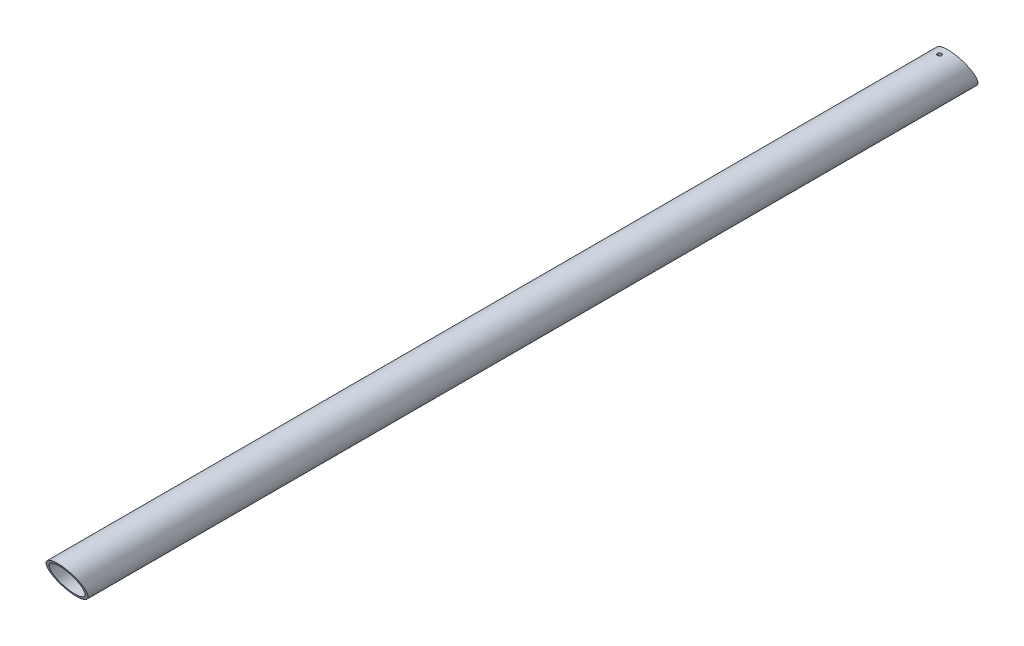
ISO-10303-21;
HEADER;
FILE_DESCRIPTION(('STEP AP214'),'2;1');
FILE_NAME('part.step','',(''),(''),'','','');
FILE_SCHEMA(('AUTOMOTIVE_DESIGN { 1 0 10303 214 1 1 1 1 }'));
ENDSEC;
DATA;
#1=APPLICATION_CONTEXT('core data for automotive mechanical design processes');
#2=APPLICATION_PROTOCOL_DEFINITION('international standard','automotive_design',2000,#1);
#3=PRODUCT_CONTEXT('',#1,'mechanical');
#4=PRODUCT('Part','Part','',(#3));
#5=PRODUCT_RELATED_PRODUCT_CATEGORY('part','',(#4));
#6=PRODUCT_DEFINITION_FORMATION('','',#4);
#7=PRODUCT_DEFINITION_CONTEXT('part definition',#1,'design');
#8=PRODUCT_DEFINITION('design','',#6,#7);
#9=PRODUCT_DEFINITION_SHAPE('','',#8);
#10=(LENGTH_UNIT() NAMED_UNIT(*) SI_UNIT(.MILLI.,.METRE.));
#11=(NAMED_UNIT(*) PLANE_ANGLE_UNIT() SI_UNIT($,.RADIAN.));
#12=(NAMED_UNIT(*) SI_UNIT($,.STERADIAN.) SOLID_ANGLE_UNIT());
#13=UNCERTAINTY_MEASURE_WITH_UNIT(LENGTH_MEASURE(1.E-05),#10,'distance_accuracy_value','');
#14=(GEOMETRIC_REPRESENTATION_CONTEXT(3) GLOBAL_UNCERTAINTY_ASSIGNED_CONTEXT((#13)) GLOBAL_UNIT_ASSIGNED_CONTEXT((#10,
#11,#12)) REPRESENTATION_CONTEXT('',''));
#15=CARTESIAN_POINT('',(0.,0.,0.));
#16=DIRECTION('',(0.,0.,1.));
#17=DIRECTION('',(1.,0.,0.));
#18=AXIS2_PLACEMENT_3D('',#15,#16,#17);
#19=CARTESIAN_POINT('',(0.,0.,914.4));
#20=DIRECTION('',(0.,0.,-1.));
#21=DIRECTION('',(-1.,0.,0.));
#22=AXIS2_PLACEMENT_3D('',#19,#20,#21);
#23=CYLINDRICAL_SURFACE('',#22,36.5125);
#24=CARTESIAN_POINT('',(0.,-36.5125,-859.6249));
#25=CARTESIAN_POINT('',(0.222576487814271,-36.5124972377471,-859.624909582565));
#26=CARTESIAN_POINT('',(0.445297477595568,-36.5104432118572,-859.643656950353));
#27=CARTESIAN_POINT('',(0.884557222297888,-36.50244682663,-859.718156608527));
#28=CARTESIAN_POINT('',(1.10108901820876,-36.4965002572248,-859.773948966693));
#29=CARTESIAN_POINT('',(1.521546422031,-36.4813896023316,-859.920888581349));
#30=CARTESIAN_POINT('',(1.72547983963618,-36.4722275341425,-860.012013674981));
#31=CARTESIAN_POINT('',(2.11511524353912,-36.4517085526281,-860.226987155));
#32=CARTESIAN_POINT('',(2.30082068103478,-36.4403520559988,-860.350829330437));
#33=CARTESIAN_POINT('',(2.64955650870538,-36.4166612749391,-860.628282758815));
#34=CARTESIAN_POINT('',(2.8124988704181,-36.4043234692108,-860.782004366179));
#35=CARTESIAN_POINT('',(3.11032605501735,-36.3800894909761,-861.11461699913));
#36=CARTESIAN_POINT('',(3.24520953827056,-36.3681933395782,-861.293509225771));
#37=CARTESIAN_POINT('',(3.48340781949558,-36.3461541705201,-861.67194371506));
#38=CARTESIAN_POINT('',(3.58664193717779,-36.3360156615186,-861.871537045479));
#39=CARTESIAN_POINT('',(3.75809588257937,-36.3186844715072,-862.285354938159));
#40=CARTESIAN_POINT('',(3.82631672654572,-36.3114917049996,-862.499579075563));
#41=CARTESIAN_POINT('',(3.92554420544375,-36.3008989519808,-862.935673654315));
#42=CARTESIAN_POINT('',(3.95669785359916,-36.2974839860447,-863.157510274744));
#43=CARTESIAN_POINT('',(3.98136120463624,-36.2947872519366,-863.603287689579));
#44=CARTESIAN_POINT('',(3.97487206914869,-36.2955053562208,-863.827228418842));
#45=CARTESIAN_POINT('',(3.92455505880391,-36.3009799320732,-864.269840134601));
#46=CARTESIAN_POINT('',(3.88088816678416,-36.3057189922581,-864.4885296677));
#47=CARTESIAN_POINT('',(3.75770589890405,-36.3186743323957,-864.9154577959));
#48=CARTESIAN_POINT('',(3.67818995836907,-36.3268906671205,-865.123696226324));
#49=CARTESIAN_POINT('',(3.485390607127,-36.3458947365218,-865.524316788054));
#50=CARTESIAN_POINT('',(3.37203625850148,-36.3566878635024,-865.71666451416));
#51=CARTESIAN_POINT('',(3.11482869938563,-36.3796249936669,-866.079666964137));
#52=CARTESIAN_POINT('',(2.97097443022705,-36.3917690437351,-866.250320934677));
#53=CARTESIAN_POINT('',(2.65595368769807,-36.4161172393799,-866.566026751027));
#54=CARTESIAN_POINT('',(2.48464827349666,-36.4283213669958,-866.710939995));
#55=CARTESIAN_POINT('',(2.12006908159625,-36.4513548335843,-866.969974918784));
#56=CARTESIAN_POINT('',(1.92679527180328,-36.4621841705483,-867.084096553612));
#57=CARTESIAN_POINT('',(1.52366601267144,-36.4812524218207,-867.278305066358));
#58=CARTESIAN_POINT('',(1.31380688536612,-36.4894907595198,-867.358384369778));
#59=CARTESIAN_POINT('',(0.883511798715035,-36.5024431483423,-867.482130707157));
#60=CARTESIAN_POINT('',(0.663076214768598,-36.5071573244535,-867.525799032471));
#61=CARTESIAN_POINT('',(0.219085242152332,-36.5125141178095,-867.575306743752));
#62=CARTESIAN_POINT('',(-0.00444859399231968,-36.513177308379,-867.581337280301));
#63=CARTESIAN_POINT('',(-0.449343632848794,-36.510412699337,-867.5559010716));
#64=CARTESIAN_POINT('',(-0.670704870399961,-36.5069849654353,-867.524434928633));
#65=CARTESIAN_POINT('',(-1.10441530596434,-36.496436690658,-867.425057228068));
#66=CARTESIAN_POINT('',(-1.31678537672704,-36.4893252748372,-867.357235713995));
#67=CARTESIAN_POINT('',(-1.72713525883041,-36.4722068648933,-867.187165364691));
#68=CARTESIAN_POINT('',(-1.9251146914091,-36.4621997945909,-867.084915623706));
#69=CARTESIAN_POINT('',(-2.30192417735271,-36.440356870867,-866.848421083629));
#70=CARTESIAN_POINT('',(-2.48067539179892,-36.428513940605,-866.714051333954));
#71=CARTESIAN_POINT('',(-2.81315496305789,-36.4043494193106,-866.417309404879));
#72=CARTESIAN_POINT('',(-2.96688257256198,-36.3920278139966,-866.254936389483));
#73=CARTESIAN_POINT('',(-3.24561967609136,-36.3682322299211,-865.905960378087));
#74=CARTESIAN_POINT('',(-3.37050329598346,-36.3567621093008,-865.719256542258));
#75=CARTESIAN_POINT('',(-3.58714071853,-36.3360285567761,-865.327413421149));
#76=CARTESIAN_POINT('',(-3.67889504581163,-36.3267650899285,-865.122274427868));
#77=CARTESIAN_POINT('',(-3.82646086141407,-36.3115186010345,-864.699807371848));
#78=CARTESIAN_POINT('',(-3.88234594574628,-36.3055288657666,-864.482505268278));
#79=CARTESIAN_POINT('',(-3.9568251409978,-36.2974877504063,-864.041532764793));
#80=CARTESIAN_POINT('',(-3.97542053839238,-36.2954362344473,-863.817862584843));
#81=CARTESIAN_POINT('',(-3.97477276641279,-36.2955070811856,-863.371754520657));
#82=CARTESIAN_POINT('',(-3.95572732519548,-36.2976076329876,-863.149316319595));
#83=CARTESIAN_POINT('',(-3.88075445043226,-36.3056993058763,-862.710820470872));
#84=CARTESIAN_POINT('',(-3.82482698630575,-36.3116904301888,-862.494762828501));
#85=CARTESIAN_POINT('',(-3.67773467286497,-36.3268819233913,-862.075170900228));
#86=CARTESIAN_POINT('',(-3.58657688352511,-36.3360816492582,-861.871634114677));
#87=CARTESIAN_POINT('',(-3.37163146655096,-36.3566550005084,-861.48271683777));
#88=CARTESIAN_POINT('',(-3.24784382465143,-36.3680286268423,-861.297336354351));
#89=CARTESIAN_POINT('',(-2.97041237664754,-36.3917398909193,-860.948981063546));
#90=CARTESIAN_POINT('',(-2.81662109194203,-36.4040821027636,-860.786124015261));
#91=CARTESIAN_POINT('',(-2.48384716766111,-36.4282984789628,-860.488446357396));
#92=CARTESIAN_POINT('',(-2.30485853632909,-36.4401725311303,-860.353632435226));
#93=CARTESIAN_POINT('',(-1.926185400205,-36.4621517964115,-860.115546828703));
#94=CARTESIAN_POINT('',(-1.72644178275622,-36.4722517239211,-860.012368737499));
#95=CARTESIAN_POINT('',(-1.3124762749608,-36.4894889518875,-859.84115882602));
#96=CARTESIAN_POINT('',(-1.09827081732187,-36.4966295512151,-859.773087849754));
#97=CARTESIAN_POINT('',(-0.735738160125483,-36.505373221796,-859.690775633001));
#98=CARTESIAN_POINT('',(-0.589718831172929,-36.5080331190741,-859.666106592913));
#99=CARTESIAN_POINT('',(-0.295820942177845,-36.5115974216966,-859.633165633659));
#100=CARTESIAN_POINT('',(-0.147942391646113,-36.5125018360174,-859.62489363065));
#101=CARTESIAN_POINT('',(0.,-36.5125,-859.6249));
#102=B_SPLINE_CURVE_WITH_KNOTS('',3,(#24,#25,#26,#27,#28,#29,#30,#31,#32,#33,#34,#35,#36,#37,
#38,#39,#40,#41,#42,#43,#44,#45,#46,#47,#48,#49,#50,#51,#52,#53,#54,#55,#56,#57,#58,#59,#60,#61,
#62,#63,#64,#65,#66,#67,#68,#69,#70,#71,#72,#73,#74,#75,#76,#77,#78,#79,#80,#81,#82,#83,#84,#85,
#86,#87,#88,#89,#90,#91,#92,#93,#94,#95,#96,#97,#98,#99,#100,#101),.UNSPECIFIED.,.T.,.F.,(4,2,2,
2,2,2,2,2,2,2,2,2,2,2,2,2,2,2,2,2,2,2,2,2,2,2,2,2,2,2,2,2,2,2,2,2,2,2,4),(0.,0.667189182881102,
1.33510117418783,2.00259488615256,2.66996197330431,3.33984237652412,4.00975475494342,
4.68136093445516,5.35294761975023,6.0218617321892,6.69075520250194,7.35676695243474,
8.02278919338708,8.69021758932518,9.35766915584735,10.0286123432556,10.6995565108677,
11.3706498870861,12.0417194612026,12.7093780903153,13.3770259954411,14.0430278861025,
14.7090472996082,15.3777010232387,16.0463747119816,16.717913542389,17.3894417380089,
18.0595876593161,18.7297104605317,19.3963224475249,20.0629349872376,20.729414010464,
21.3958933250645,22.0657351419396,22.7357365125185,23.4077013399665,24.07891507578,
24.5223854040618,24.9658534647054),.UNSPECIFIED.);
#103=CARTESIAN_POINT('',(0.,-36.5125,-859.6249));
#104=VERTEX_POINT('',#103);
#105=EDGE_CURVE('E57',#104,#104,#102,.T.);
#106=ORIENTED_EDGE('',*,*,#105,.T.);
#107=EDGE_LOOP('',(#106));
#108=FACE_BOUND('',#107,.T.);
#109=CARTESIAN_POINT('',(0.,0.,-861.441));
#110=DIRECTION('',(0.,-0.441082980740271,0.897466324772845));
#111=DIRECTION('',(0.,-0.897466324772845,-0.441082980740271));
#112=AXIS2_PLACEMENT_3D('',#109,#110,#111);
#113=ELLIPSE('',#112,40.6839777628888,36.5125);
#114=CARTESIAN_POINT('',(0.,-36.5125,-879.386010180026));
#115=VERTEX_POINT('',#114);
#116=EDGE_CURVE('E50',#115,#115,#113,.T.);
#117=ORIENTED_EDGE('',*,*,#116,.T.);
#118=EDGE_LOOP('',(#117));
#119=FACE_BOUND('',#118,.T.);
#120=CARTESIAN_POINT('',(0.,0.,861.441));
#121=DIRECTION('',(0.,0.441082980740271,-0.897466324772845));
#122=DIRECTION('',(0.,-0.897466324772845,-0.441082980740271));
#123=AXIS2_PLACEMENT_3D('',#120,#121,#122);
#124=ELLIPSE('',#123,40.6839777628888,36.5125);
#125=CARTESIAN_POINT('',(0.,-36.5125,843.495989819974));
#126=VERTEX_POINT('',#125);
#127=EDGE_CURVE('E10',#126,#126,#124,.T.);
#128=ORIENTED_EDGE('',*,*,#127,.T.);
#129=EDGE_LOOP('',(#128));
#130=FACE_BOUND('',#129,.T.);
#131=CARTESIAN_POINT('',(0.,36.5125,-831.596089819974));
#132=CARTESIAN_POINT('',(-0.222576487814271,36.5124972377471,-831.596080237409));
#133=CARTESIAN_POINT('',(-0.445297477595569,36.5104432118572,-831.577332869621));
#134=CARTESIAN_POINT('',(-0.884557222297887,36.50244682663,-831.502833211447));
#135=CARTESIAN_POINT('',(-1.10108901820875,36.4965002572248,-831.447040853281));
#136=CARTESIAN_POINT('',(-1.52154642203101,36.4813896023316,-831.300101238625));
#137=CARTESIAN_POINT('',(-1.72547983963622,36.4722275341425,-831.208976144993));
#138=CARTESIAN_POINT('',(-2.11511524353916,36.4517085526281,-830.994002664974));
#139=CARTESIAN_POINT('',(-2.3008206810348,36.4403520559988,-830.870160489537));
#140=CARTESIAN_POINT('',(-2.64955650870538,36.4166612749391,-830.592707061159));
#141=CARTESIAN_POINT('',(-2.8124988704181,36.4043234692108,-830.438985453795));
#142=CARTESIAN_POINT('',(-3.11032605501735,36.3800894909761,-830.106372820844));
#143=CARTESIAN_POINT('',(-3.24520953827057,36.3681933395782,-829.927480594203));
#144=CARTESIAN_POINT('',(-3.48340781949557,36.3461541705201,-829.549046104914));
#145=CARTESIAN_POINT('',(-3.58664193717775,36.3360156615186,-829.349452774495));
#146=CARTESIAN_POINT('',(-3.75809588257934,36.3186844715072,-828.935634881815));
#147=CARTESIAN_POINT('',(-3.82631672654571,36.3114917049996,-828.721410744411));
#148=CARTESIAN_POINT('',(-3.92554420544377,36.3008989519808,-828.285316165659));
#149=CARTESIAN_POINT('',(-3.95669785359918,36.2974839860447,-828.06347954523));
#150=CARTESIAN_POINT('',(-3.98136120463624,36.2947872519366,-827.617702130395));
#151=CARTESIAN_POINT('',(-3.97487206914868,36.2955053562208,-827.393761401132));
#152=CARTESIAN_POINT('',(-3.92455505880391,36.3009799320732,-826.951149685373));
#153=CARTESIAN_POINT('',(-3.88088816678415,36.3057189922581,-826.732460152274));
#154=CARTESIAN_POINT('',(-3.75770589890402,36.3186743323957,-826.305532024074));
#155=CARTESIAN_POINT('',(-3.67818995836905,36.3268906671205,-826.09729359365));
#156=CARTESIAN_POINT('',(-3.48539060712699,36.3458947365218,-825.696673031921));
#157=CARTESIAN_POINT('',(-3.37203625850146,36.3566878635024,-825.504325305814));
#158=CARTESIAN_POINT('',(-3.1148286993856,36.3796249936669,-825.141322855837));
#159=CARTESIAN_POINT('',(-2.97097443022703,36.3917690437351,-824.970668885297));
#160=CARTESIAN_POINT('',(-2.65595368769807,36.4161172393799,-824.654963068947));
#161=CARTESIAN_POINT('',(-2.48464827349666,36.4283213669958,-824.510049824974));
#162=CARTESIAN_POINT('',(-2.12006908159625,36.4513548335843,-824.25101490119));
#163=CARTESIAN_POINT('',(-1.92679527180329,36.4621841705483,-824.136893266362));
#164=CARTESIAN_POINT('',(-1.52366601267143,36.4812524218207,-823.942684753616));
#165=CARTESIAN_POINT('',(-1.3138068853661,36.4894907595198,-823.862605450195));
#166=CARTESIAN_POINT('',(-0.883511798715017,36.5024431483423,-823.738859112817));
#167=CARTESIAN_POINT('',(-0.66307621476859,36.5071573244535,-823.695190787503));
#168=CARTESIAN_POINT('',(-0.219085242152332,36.5125141178095,-823.645683076222));
#169=CARTESIAN_POINT('',(0.00444859399232236,36.513177308379,-823.639652539673));
#170=CARTESIAN_POINT('',(0.449343632848799,36.510412699337,-823.665088748374));
#171=CARTESIAN_POINT('',(0.670704870399966,36.5069849654353,-823.696554891341));
#172=CARTESIAN_POINT('',(1.10441530596432,36.496436690658,-823.795932591907));
#173=CARTESIAN_POINT('',(1.31678537672701,36.4893252748372,-823.863754105979));
#174=CARTESIAN_POINT('',(1.72713525883038,36.4722068648933,-824.033824455283));
#175=CARTESIAN_POINT('',(1.92511469140909,36.4621997945909,-824.136074196268));
#176=CARTESIAN_POINT('',(2.30192417735274,36.440356870867,-824.372568736345));
#177=CARTESIAN_POINT('',(2.48067539179895,36.428513940605,-824.506938486021));
#178=CARTESIAN_POINT('',(2.81315496305792,36.4043494193106,-824.803680415095));
#179=CARTESIAN_POINT('',(2.96688257256201,36.3920278139966,-824.966053430491));
#180=CARTESIAN_POINT('',(3.24561967609143,36.3682322299211,-825.315029441888));
#181=CARTESIAN_POINT('',(3.37050329598357,36.3567621093007,-825.501733277716));
#182=CARTESIAN_POINT('',(3.58714071853006,36.336028556776,-825.893576398825));
#183=CARTESIAN_POINT('',(3.67889504581166,36.3267650899285,-826.098715392106));
#184=CARTESIAN_POINT('',(3.82646086141408,36.3115186010345,-826.521182448126));
#185=CARTESIAN_POINT('',(3.88234594574628,36.3055288657666,-826.738484551696));
#186=CARTESIAN_POINT('',(3.9568251409978,36.2974877504063,-827.179457055181));
#187=CARTESIAN_POINT('',(3.97542053839238,36.2954362344473,-827.403127235131));
#188=CARTESIAN_POINT('',(3.97477276641279,36.2955070811856,-827.849235299317));
#189=CARTESIAN_POINT('',(3.95572732519549,36.2976076329876,-828.071673500379));
#190=CARTESIAN_POINT('',(3.88075445043226,36.3056993058763,-828.510169349102));
#191=CARTESIAN_POINT('',(3.82482698630575,36.3116904301888,-828.726226991473));
#192=CARTESIAN_POINT('',(3.67773467286497,36.3268819233913,-829.145818919746));
#193=CARTESIAN_POINT('',(3.58657688352511,36.3360816492582,-829.349355705297));
#194=CARTESIAN_POINT('',(3.37163146655096,36.3566550005084,-829.738272982204));
#195=CARTESIAN_POINT('',(3.24784382465143,36.3680286268423,-829.923653465623));
#196=CARTESIAN_POINT('',(2.97041237664751,36.3917398909193,-830.272008756428));
#197=CARTESIAN_POINT('',(2.81662109194197,36.4040821027636,-830.434865804713));
#198=CARTESIAN_POINT('',(2.48384716766103,36.4282984789628,-830.732543462578));
#199=CARTESIAN_POINT('',(2.30485853632905,36.4401725311303,-830.867357384749));
#200=CARTESIAN_POINT('',(1.92618540020501,36.4621517964115,-831.105442991271));
#201=CARTESIAN_POINT('',(1.72644178275625,36.4722517239211,-831.208621082475));
#202=CARTESIAN_POINT('',(1.31247627496083,36.4894889518875,-831.379830993955));
#203=CARTESIAN_POINT('',(1.09827081732189,36.4966295512151,-831.44790197022));
#204=CARTESIAN_POINT('',(0.735738160125484,36.505373221796,-831.530214186973));
#205=CARTESIAN_POINT('',(0.589718831172929,36.5080331190741,-831.554883227061));
#206=CARTESIAN_POINT('',(0.295820942177845,36.5115974216966,-831.587824186315));
#207=CARTESIAN_POINT('',(0.147942391646113,36.5125018360174,-831.596096189324));
#208=CARTESIAN_POINT('',(0.,36.5125,-831.596089819974));
#209=B_SPLINE_CURVE_WITH_KNOTS('',3,(#131,#132,#133,#134,#135,#136,#137,#138,#139,#140,#141,
#142,#143,#144,#145,#146,#147,#148,#149,#150,#151,#152,#153,#154,#155,#156,#157,#158,#159,#160,
#161,#162,#163,#164,#165,#166,#167,#168,#169,#170,#171,#172,#173,#174,#175,#176,#177,#178,#179,
#180,#181,#182,#183,#184,#185,#186,#187,#188,#189,#190,#191,#192,#193,#194,#195,#196,#197,#198,
#199,#200,#201,#202,#203,#204,#205,#206,#207,#208),.UNSPECIFIED.,.T.,.F.,(4,2,2,2,2,2,2,2,2,2,2,
2,2,2,2,2,2,2,2,2,2,2,2,2,2,2,2,2,2,2,2,2,2,2,2,2,2,2,4),(0.,0.667189182881103,1.33510117418783,
2.00259488615261,2.66996197330432,3.33984237652413,4.00975475494342,4.68136093445514,
5.35294761975023,6.02186173218931,6.69075520250194,7.35676695243486,8.02278919338708,
8.69021758932531,9.35766915584735,10.0286123432556,10.6995565108677,11.3706498870861,
12.0417194612026,12.7093780903153,13.3770259954411,14.0430278861025,14.7090472996082,
15.3777010232388,16.0463747119815,16.7179135423894,17.3894417380089,18.0595876593161,
18.7297104605317,19.3963224475248,20.0629349872375,20.729414010464,21.3958933250644,
22.0657351419398,22.7357365125185,23.4077013399665,24.07891507578,24.5223854040618,
24.9658534647054),.UNSPECIFIED.);
#210=CARTESIAN_POINT('',(0.,36.5125,-831.596089819974));
#211=VERTEX_POINT('',#210);
#212=EDGE_CURVE('E63',#211,#211,#209,.T.);
#213=ORIENTED_EDGE('',*,*,#212,.F.);
#214=EDGE_LOOP('',(#213));
#215=FACE_BOUND('',#214,.T.);
#216=ADVANCED_FACE('F34',(#108,#119,#130,#215),#23,.T.);
#217=CARTESIAN_POINT('',(0.,0.,914.4));
#218=DIRECTION('',(0.,0.,-1.));
#219=DIRECTION('',(-1.,0.,0.));
#220=AXIS2_PLACEMENT_3D('',#217,#218,#219);
#221=CYLINDRICAL_SURFACE('',#220,31.3563);
#222=CARTESIAN_POINT('',(0.,0.,861.441));
#223=DIRECTION('',(0.,0.441082980740271,-0.897466324772845));
#224=DIRECTION('',(0.,-0.897466324772845,-0.441082980740271));
#225=AXIS2_PLACEMENT_3D('',#222,#223,#224);
#226=ELLIPSE('',#225,34.9386925553296,31.3563);
#227=CARTESIAN_POINT('',(0.,-31.3563,846.030137344527));
#228=VERTEX_POINT('',#227);
#229=EDGE_CURVE('E45',#228,#228,#226,.T.);
#230=ORIENTED_EDGE('',*,*,#229,.F.);
#231=EDGE_LOOP('',(#230));
#232=FACE_BOUND('',#231,.T.);
#233=CARTESIAN_POINT('',(0.,0.,-861.441));
#234=DIRECTION('',(0.,-0.441082980740271,0.897466324772845));
#235=DIRECTION('',(0.,-0.897466324772845,-0.441082980740271));
#236=AXIS2_PLACEMENT_3D('',#233,#234,#235);
#237=ELLIPSE('',#236,34.9386925553296,31.3563);
#238=CARTESIAN_POINT('',(0.,-31.3563,-876.851862655473));
#239=VERTEX_POINT('',#238);
#240=EDGE_CURVE('E55',#239,#239,#237,.T.);
#241=ORIENTED_EDGE('',*,*,#240,.F.);
#242=EDGE_LOOP('',(#241));
#243=FACE_BOUND('',#242,.T.);
#244=CARTESIAN_POINT('',(0.,-31.3563,-859.6249));
#245=CARTESIAN_POINT('',(0.222326540524774,-31.3562968624126,-859.624909429066));
#246=CARTESIAN_POINT('',(0.444791365658576,-31.3539104869967,-859.643614910991));
#247=CARTESIAN_POINT('',(0.883528774977545,-31.344620314296,-859.717938444346));
#248=CARTESIAN_POINT('',(1.09979467776843,-31.3377118209001,-859.773594869303));
#249=CARTESIAN_POINT('',(1.51971924723782,-31.3201555667071,-859.92015261146));
#250=CARTESIAN_POINT('',(1.7233863596926,-31.309510343543,-860.011030014255));
#251=CARTESIAN_POINT('',(2.11254062321832,-31.2856640944633,-860.225397323704));
#252=CARTESIAN_POINT('',(2.29803084668114,-31.2724635016014,-860.348881705805));
#253=CARTESIAN_POINT('',(2.64665321390466,-31.2448964841816,-860.625704186949));
#254=CARTESIAN_POINT('',(2.80966773283121,-31.2305245094155,-860.779189881655));
#255=CARTESIAN_POINT('',(3.10769817132978,-31.2022792044089,-861.111341143337));
#256=CARTESIAN_POINT('',(3.24271265254967,-31.1884058998152,-861.290008003069));
#257=CARTESIAN_POINT('',(3.48134989962599,-31.1626741397826,-861.66821602387));
#258=CARTESIAN_POINT('',(3.58486222164708,-31.1508228356615,-861.86782739997));
#259=CARTESIAN_POINT('',(3.75685145915391,-31.1305502950843,-862.281775860338));
#260=CARTESIAN_POINT('',(3.82532974042044,-31.1221289249169,-862.496112370186));
#261=CARTESIAN_POINT('',(3.92494909178797,-31.1097228599453,-862.932204949464));
#262=CARTESIAN_POINT('',(3.95628896419553,-31.1057145502456,-863.153914921689));
#263=CARTESIAN_POINT('',(3.98135708165168,-31.1025162083961,-863.599480901028));
#264=CARTESIAN_POINT('',(3.97508688096848,-31.1033259771352,-863.823336819078));
#265=CARTESIAN_POINT('',(3.9252759859054,-31.1096506883095,-864.265453528603));
#266=CARTESIAN_POINT('',(3.88195443813703,-31.1151379641868,-864.483739462224));
#267=CARTESIAN_POINT('',(3.75961258387549,-31.1301562538035,-864.909918097247));
#268=CARTESIAN_POINT('',(3.68059153523234,-31.139687351609,-865.117810582482));
#269=CARTESIAN_POINT('',(3.48885874570643,-31.1617506834537,-865.517980900717));
#270=CARTESIAN_POINT('',(3.37605193023379,-31.1742913665389,-865.71021269598));
#271=CARTESIAN_POINT('',(3.12001777272532,-31.2009543420604,-866.073100347524));
#272=CARTESIAN_POINT('',(2.97678899974412,-31.2150767088791,-866.243755188297));
#273=CARTESIAN_POINT('',(2.6627629020443,-31.243434748891,-866.559916540141));
#274=CARTESIAN_POINT('',(2.49177671521988,-31.2576705134678,-866.705235522185));
#275=CARTESIAN_POINT('',(2.12773930696867,-31.2845573849783,-866.965139409822));
#276=CARTESIAN_POINT('',(1.93468803215788,-31.2972084880779,-867.079724241054));
#277=CARTESIAN_POINT('',(1.53185467969675,-31.319508771436,-867.274907941717));
#278=CARTESIAN_POINT('',(1.32206676490826,-31.3291568985635,-867.355494891749));
#279=CARTESIAN_POINT('',(0.891787150751493,-31.344354648267,-867.480245470564));
#280=CARTESIAN_POINT('',(0.671295967430653,-31.34990446823,-867.524410853532));
#281=CARTESIAN_POINT('',(0.227490025269631,-31.3562545988406,-867.574821142323));
#282=CARTESIAN_POINT('',(0.00420505013694615,-31.3570872601081,-867.581324345011));
#283=CARTESIAN_POINT('',(-0.440271540585478,-31.3539966467742,-867.556907577526));
#284=CARTESIAN_POINT('',(-0.661463201950964,-31.3500734764148,-867.525988427604));
#285=CARTESIAN_POINT('',(-1.09471087722965,-31.3379321681415,-867.427819229561));
#286=CARTESIAN_POINT('',(-1.30679528076967,-31.3297286136024,-867.360692515445));
#287=CARTESIAN_POINT('',(-1.71669680444561,-31.3099448720045,-867.192142016281));
#288=CARTESIAN_POINT('',(-1.91451342729018,-31.2983645673229,-867.090717036496));
#289=CARTESIAN_POINT('',(-2.29141651288809,-31.273037475616,-866.855825393327));
#290=CARTESIAN_POINT('',(-2.47039821626078,-31.2592795381135,-866.722191857873));
#291=CARTESIAN_POINT('',(-2.80348457825703,-31.2311706047573,-866.426912302419));
#292=CARTESIAN_POINT('',(-2.95758821963318,-31.216819584683,-866.26526513752));
#293=CARTESIAN_POINT('',(-3.23746198549616,-31.1890419433267,-865.91740830698));
#294=CARTESIAN_POINT('',(-3.363060762431,-31.1756212326016,-865.731060239976));
#295=CARTESIAN_POINT('',(-3.5811752985337,-31.1513214514626,-865.339762097684));
#296=CARTESIAN_POINT('',(-3.67369173680034,-31.1404423288778,-865.134812404351));
#297=CARTESIAN_POINT('',(-3.82273875654738,-31.1224979200816,-864.712678912592));
#298=CARTESIAN_POINT('',(-3.87936552460981,-31.1154224476495,-864.495529527272));
#299=CARTESIAN_POINT('',(-3.95533530973236,-31.1058573664069,-864.054708554277));
#300=CARTESIAN_POINT('',(-3.97468011485141,-31.1033675376672,-863.831037279917));
#301=CARTESIAN_POINT('',(-3.97550340683699,-31.1032621796977,-863.385226610738));
#302=CARTESIAN_POINT('',(-3.95725109891395,-31.1056119973121,-863.163087673277));
#303=CARTESIAN_POINT('',(-3.88396879543805,-31.1148466108706,-862.725062255858));
#304=CARTESIAN_POINT('',(-3.82893879946638,-31.1217314068663,-862.509175775972));
#305=CARTESIAN_POINT('',(-3.68374812690574,-31.1392494233226,-862.089821496082));
#306=CARTESIAN_POINT('',(-3.59360080387219,-31.14988121882,-861.886349009565));
#307=CARTESIAN_POINT('',(-3.38076090981597,-31.1736976058713,-861.497375485869));
#308=CARTESIAN_POINT('',(-3.25806788504157,-31.1868822330161,-861.311874699301));
#309=CARTESIAN_POINT('',(-2.9826219125622,-31.2144317737548,-860.962734634285));
#310=CARTESIAN_POINT('',(-2.82966839474008,-31.2288041683321,-860.799254169715));
#311=CARTESIAN_POINT('',(-2.49846218385267,-31.2570440156406,-860.500177673118));
#312=CARTESIAN_POINT('',(-2.32020354072955,-31.2709113486491,-860.364588217591));
#313=CARTESIAN_POINT('',(-1.94264631412,-31.2966386289597,-860.124689612304));
#314=CARTESIAN_POINT('',(-1.74326821172551,-31.3084905177504,-860.020504805191));
#315=CARTESIAN_POINT('',(-1.32980596312079,-31.3287700726416,-859.847244835607));
#316=CARTESIAN_POINT('',(-1.11573803495464,-31.337201446194,-859.778131638976));
#317=CARTESIAN_POINT('',(-0.750476571090355,-31.347664502407,-859.693464299606));
#318=CARTESIAN_POINT('',(-0.601583417668706,-31.3508869823029,-859.667789790545));
#319=CARTESIAN_POINT('',(-0.301814745222286,-31.3552057880182,-859.633504505399));
#320=CARTESIAN_POINT('',(-0.150939241399781,-31.3563021301328,-859.624893598532));
#321=CARTESIAN_POINT('',(0.,-31.3563,-859.6249));
#322=B_SPLINE_CURVE_WITH_KNOTS('',3,(#244,#245,#246,#247,#248,#249,#250,#251,#252,#253,#254,
#255,#256,#257,#258,#259,#260,#261,#262,#263,#264,#265,#266,#267,#268,#269,#270,#271,#272,#273,
#274,#275,#276,#277,#278,#279,#280,#281,#282,#283,#284,#285,#286,#287,#288,#289,#290,#291,#292,
#293,#294,#295,#296,#297,#298,#299,#300,#301,#302,#303,#304,#305,#306,#307,#308,#309,#310,#311,
#312,#313,#314,#315,#316,#317,#318,#319,#320,#321),.UNSPECIFIED.,.T.,.F.,(4,2,2,2,2,2,2,2,2,2,2,
2,2,2,2,2,2,2,2,2,2,2,2,2,2,2,2,2,2,2,2,2,2,2,2,2,2,2,4),(0.,0.666428274398941,1.33354971889581,
2.0002189913513,2.66677538337315,3.33669750191311,4.00665402559795,4.6789329957664,
5.35118575555024,6.01982344535946,6.68843350333867,7.35311608522678,8.01781248570752,
8.68439723136029,9.35101333783767,10.0223714404047,10.6937311672816,11.3653260725733,
12.0368886296849,12.7038399338771,13.3707766195878,14.035455731251,14.7001579985542,
15.3683810451123,16.0366314079497,16.7087981898529,17.3809511730386,18.0512950403044,
18.7216067567907,19.387135552395,20.0526643555779,20.7179403344405,21.3832255890597,
22.0530778171282,22.7230878109274,23.3957167927397,24.067614760337,24.5200616382973,
24.9725050485519),.UNSPECIFIED.);
#323=CARTESIAN_POINT('',(0.,-31.3563,-859.6249));
#324=VERTEX_POINT('',#323);
#325=EDGE_CURVE('E58',#324,#324,#322,.T.);
#326=ORIENTED_EDGE('',*,*,#325,.F.);
#327=EDGE_LOOP('',(#326));
#328=FACE_BOUND('',#327,.T.);
#329=CARTESIAN_POINT('',(0.,31.3563,-831.596089819974));
#330=CARTESIAN_POINT('',(-0.222326540524766,31.3562968624126,-831.596080390908));
#331=CARTESIAN_POINT('',(-0.444791365658558,31.3539104869967,-831.577374908983));
#332=CARTESIAN_POINT('',(-0.883528774977531,31.344620314296,-831.503051375628));
#333=CARTESIAN_POINT('',(-1.09979467776842,31.3377118209001,-831.447394950671));
#334=CARTESIAN_POINT('',(-1.5197192472378,31.3201555667071,-831.300837208514));
#335=CARTESIAN_POINT('',(-1.72338635969255,31.309510343543,-831.209959805719));
#336=CARTESIAN_POINT('',(-2.11254062321829,31.2856640944633,-830.99559249627));
#337=CARTESIAN_POINT('',(-2.29803084668115,31.2724635016014,-830.872108114169));
#338=CARTESIAN_POINT('',(-2.64665321390471,31.2448964841816,-830.595285633025));
#339=CARTESIAN_POINT('',(-2.80966773283125,31.2305245094155,-830.441799938319));
#340=CARTESIAN_POINT('',(-3.10769817132979,31.2022792044089,-830.109648676637));
#341=CARTESIAN_POINT('',(-3.24271265254968,31.1884058998152,-829.930981816905));
#342=CARTESIAN_POINT('',(-3.48134989962599,31.1626741397826,-829.552773796104));
#343=CARTESIAN_POINT('',(-3.58486222164705,31.1508228356615,-829.353162420005));
#344=CARTESIAN_POINT('',(-3.75685145915389,31.1305502950843,-828.939213959637));
#345=CARTESIAN_POINT('',(-3.82532974042044,31.1221289249169,-828.724877449788));
#346=CARTESIAN_POINT('',(-3.92494909178797,31.1097228599453,-828.288784870511));
#347=CARTESIAN_POINT('',(-3.95628896419554,31.1057145502456,-828.067074898286));
#348=CARTESIAN_POINT('',(-3.98135708165169,31.1025162083961,-827.621508918946));
#349=CARTESIAN_POINT('',(-3.97508688096848,31.1033259771352,-827.397653000896));
#350=CARTESIAN_POINT('',(-3.92527598590541,31.1096506883095,-826.955536291371));
#351=CARTESIAN_POINT('',(-3.88195443813705,31.1151379641868,-826.73725035775));
#352=CARTESIAN_POINT('',(-3.75961258387552,31.1301562538035,-826.311071722727));
#353=CARTESIAN_POINT('',(-3.68059153523235,31.139687351609,-826.103179237492));
#354=CARTESIAN_POINT('',(-3.48885874570642,31.1617506834537,-825.703008919256));
#355=CARTESIAN_POINT('',(-3.37605193023377,31.1742913665389,-825.510777123994));
#356=CARTESIAN_POINT('',(-3.12001777272529,31.2009543420604,-825.14788947245));
#357=CARTESIAN_POINT('',(-2.9767889997441,31.2150767088791,-824.977234631677));
#358=CARTESIAN_POINT('',(-2.6627629020443,31.243434748891,-824.661073279834));
#359=CARTESIAN_POINT('',(-2.49177671521988,31.2576705134678,-824.515754297789));
#360=CARTESIAN_POINT('',(-2.12773930696867,31.2845573849783,-824.255850410152));
#361=CARTESIAN_POINT('',(-1.93468803215789,31.2972084880779,-824.14126557892));
#362=CARTESIAN_POINT('',(-1.53185467969675,31.319508771436,-823.946081878257));
#363=CARTESIAN_POINT('',(-1.32206676490824,31.3291568985635,-823.865494928225));
#364=CARTESIAN_POINT('',(-0.891787150751476,31.344354648267,-823.74074434941));
#365=CARTESIAN_POINT('',(-0.671295967430647,31.34990446823,-823.696578966442));
#366=CARTESIAN_POINT('',(-0.227490025269635,31.3562545988406,-823.646168677651));
#367=CARTESIAN_POINT('',(-0.00420505013694848,31.3570872601081,-823.639665474963));
#368=CARTESIAN_POINT('',(0.440271540585477,31.3539966467742,-823.664082242448));
#369=CARTESIAN_POINT('',(0.661463201950963,31.3500734764148,-823.69500139237));
#370=CARTESIAN_POINT('',(1.09471087722965,31.3379321681415,-823.793170590413));
#371=CARTESIAN_POINT('',(1.30679528076967,31.3297286136024,-823.860297304529));
#372=CARTESIAN_POINT('',(1.7166968044456,31.3099448720045,-824.028847803693));
#373=CARTESIAN_POINT('',(1.91451342729018,31.2983645673229,-824.130272783478));
#374=CARTESIAN_POINT('',(2.29141651288811,31.273037475616,-824.365164426647));
#375=CARTESIAN_POINT('',(2.47039821626082,31.2592795381134,-824.498797962101));
#376=CARTESIAN_POINT('',(2.80348457825707,31.2311706047573,-824.794077517555));
#377=CARTESIAN_POINT('',(2.9575882196332,31.216819584683,-824.955724682454));
#378=CARTESIAN_POINT('',(3.23746198549614,31.1890419433267,-825.303581512994));
#379=CARTESIAN_POINT('',(3.36306076243096,31.1756212326016,-825.489929579998));
#380=CARTESIAN_POINT('',(3.58117529853366,31.1513214514626,-825.88122772229));
#381=CARTESIAN_POINT('',(3.67369173680033,31.1404423288778,-826.086177415623));
#382=CARTESIAN_POINT('',(3.82273875654739,31.1224979200816,-826.508310907382));
#383=CARTESIAN_POINT('',(3.87936552460981,31.1154224476495,-826.725460292702));
#384=CARTESIAN_POINT('',(3.95533530973236,31.1058573664069,-827.166281265697));
#385=CARTESIAN_POINT('',(3.97468011485142,31.1033675376672,-827.389952540057));
#386=CARTESIAN_POINT('',(3.97550340683699,31.1032621796977,-827.835763209236));
#387=CARTESIAN_POINT('',(3.95725109891396,31.1056119973121,-828.057902146698));
#388=CARTESIAN_POINT('',(3.88396879543805,31.1148466108706,-828.495927564116));
#389=CARTESIAN_POINT('',(3.82893879946638,31.1217314068663,-828.711814044001));
#390=CARTESIAN_POINT('',(3.68374812690573,31.1392494233226,-829.131168323892));
#391=CARTESIAN_POINT('',(3.59360080387216,31.14988121882,-829.334640810409));
#392=CARTESIAN_POINT('',(3.38076090981594,31.1736976058713,-829.723614334105));
#393=CARTESIAN_POINT('',(3.25806788504155,31.1868822330161,-829.909115120673));
#394=CARTESIAN_POINT('',(2.98262191256215,31.2144317737548,-830.258255185689));
#395=CARTESIAN_POINT('',(2.82966839473997,31.2288041683321,-830.421735650259));
#396=CARTESIAN_POINT('',(2.49846218385255,31.2570440156406,-830.720812146856));
#397=CARTESIAN_POINT('',(2.32020354072949,31.2709113486491,-830.856401602383));
#398=CARTESIAN_POINT('',(1.94264631412001,31.2966386289597,-831.09630020767));
#399=CARTESIAN_POINT('',(1.74326821172551,31.3084905177504,-831.200485014783));
#400=CARTESIAN_POINT('',(1.32980596312079,31.3287700726416,-831.373744984367));
#401=CARTESIAN_POINT('',(1.11573803495464,31.337201446194,-831.442858180998));
#402=CARTESIAN_POINT('',(0.75047657109036,31.347664502407,-831.527525520368));
#403=CARTESIAN_POINT('',(0.60158341766871,31.3508869823029,-831.553200029429));
#404=CARTESIAN_POINT('',(0.301814745222288,31.3552057880182,-831.587485314575));
#405=CARTESIAN_POINT('',(0.150939241399782,31.3563021301328,-831.596096221442));
#406=CARTESIAN_POINT('',(0.,31.3563,-831.596089819974));
#407=B_SPLINE_CURVE_WITH_KNOTS('',3,(#329,#330,#331,#332,#333,#334,#335,#336,#337,#338,#339,
#340,#341,#342,#343,#344,#345,#346,#347,#348,#349,#350,#351,#352,#353,#354,#355,#356,#357,#358,
#359,#360,#361,#362,#363,#364,#365,#366,#367,#368,#369,#370,#371,#372,#373,#374,#375,#376,#377,
#378,#379,#380,#381,#382,#383,#384,#385,#386,#387,#388,#389,#390,#391,#392,#393,#394,#395,#396,
#397,#398,#399,#400,#401,#402,#403,#404,#405,#406),.UNSPECIFIED.,.T.,.F.,(4,2,2,2,2,2,2,2,2,2,2,
2,2,2,2,2,2,2,2,2,2,2,2,2,2,2,2,2,2,2,2,2,2,2,2,2,2,2,4),(0.,0.666428274398917,1.33354971889581,
2.00021899135126,2.66677538337308,3.33669750191324,4.00665402559795,4.67893299576629,
5.35118575555024,6.01982344535947,6.68843350333867,7.35311608522667,8.01781248570753,
8.68439723136042,9.35101333783768,10.0223714404047,10.6937311672816,11.3653260725734,
12.0368886296849,12.7038399338771,13.3707766195878,14.0354557312511,14.7001579985542,
15.3683810451123,16.0366314079497,16.7087981898529,17.3809511730386,18.0512950403044,
18.7216067567907,19.387135552395,20.0526643555779,20.7179403344407,21.3832255890597,
22.0530778171284,22.7230878109274,23.3957167927397,24.067614760337,24.5200616382973,
24.9725050485519),.UNSPECIFIED.);
#408=CARTESIAN_POINT('',(0.,31.3563,-831.596089819974));
#409=VERTEX_POINT('',#408);
#410=EDGE_CURVE('E38',#409,#409,#407,.T.);
#411=ORIENTED_EDGE('',*,*,#410,.T.);
#412=EDGE_LOOP('',(#411));
#413=FACE_BOUND('',#412,.T.);
#414=ADVANCED_FACE('F64',(#232,#243,#328,#413),#221,.F.);
#415=CARTESIAN_POINT('',(-76.2,192.708539461506,956.152583770343));
#416=DIRECTION('',(0.,0.441082980740271,-0.897466324772845));
#417=DIRECTION('',(0.,0.897466324772845,0.441082980740271));
#418=AXIS2_PLACEMENT_3D('',#415,#416,#417);
#419=PLANE('',#418);
#420=ORIENTED_EDGE('',*,*,#229,.T.);
#421=EDGE_LOOP('',(#420));
#422=FACE_BOUND('',#421,.T.);
#423=ORIENTED_EDGE('',*,*,#127,.F.);
#424=EDGE_LOOP('',(#423));
#425=FACE_BOUND('',#424,.T.);
#426=ADVANCED_FACE('F97',(#422,#425),#419,.F.);
#427=CARTESIAN_POINT('',(-76.2,192.708539461506,-766.729416229657));
#428=DIRECTION('',(0.,-0.441082980740271,0.897466324772845));
#429=DIRECTION('',(0.,-0.897466324772845,-0.441082980740271));
#430=AXIS2_PLACEMENT_3D('',#427,#428,#429);
#431=PLANE('',#430);
#432=ORIENTED_EDGE('',*,*,#240,.T.);
#433=EDGE_LOOP('',(#432));
#434=FACE_BOUND('',#433,.T.);
#435=ORIENTED_EDGE('',*,*,#116,.F.);
#436=EDGE_LOOP('',(#435));
#437=FACE_BOUND('',#436,.T.);
#438=ADVANCED_FACE('F72',(#434,#437),#431,.F.);
#439=CARTESIAN_POINT('',(0.,-63.5,-863.6));
#440=DIRECTION('',(0.,1.,0.));
#441=DIRECTION('',(0.,0.,1.));
#442=AXIS2_PLACEMENT_3D('',#439,#440,#441);
#443=CYLINDRICAL_SURFACE('',#442,3.97510000000001);
#444=ORIENTED_EDGE('',*,*,#325,.T.);
#445=EDGE_LOOP('',(#444));
#446=FACE_BOUND('',#445,.T.);
#447=ORIENTED_EDGE('',*,*,#105,.F.);
#448=EDGE_LOOP('',(#447));
#449=FACE_BOUND('',#448,.T.);
#450=ADVANCED_FACE('F67',(#446,#449),#443,.F.);
#451=CARTESIAN_POINT('',(0.,36.5125,-827.620989819974));
#452=DIRECTION('',(0.,-1.,0.));
#453=DIRECTION('',(0.,0.,-1.));
#454=AXIS2_PLACEMENT_3D('',#451,#452,#453);
#455=CYLINDRICAL_SURFACE('',#454,3.97510000000001);
#456=ORIENTED_EDGE('',*,*,#410,.F.);
#457=EDGE_LOOP('',(#456));
#458=FACE_BOUND('',#457,.T.);
#459=ORIENTED_EDGE('',*,*,#212,.T.);
#460=EDGE_LOOP('',(#459));
#461=FACE_BOUND('',#460,.T.);
#462=ADVANCED_FACE('F71',(#458,#461),#455,.F.);
#463=CLOSED_SHELL('',(#216,#414,#426,#438,#450,#462));
#464=MANIFOLD_SOLID_BREP('B2',#463);
#465=ADVANCED_BREP_SHAPE_REPRESENTATION('',(#18,#464),#14);
#466=SHAPE_DEFINITION_REPRESENTATION(#9,#465);
ENDSEC;
END-ISO-10303-21;
